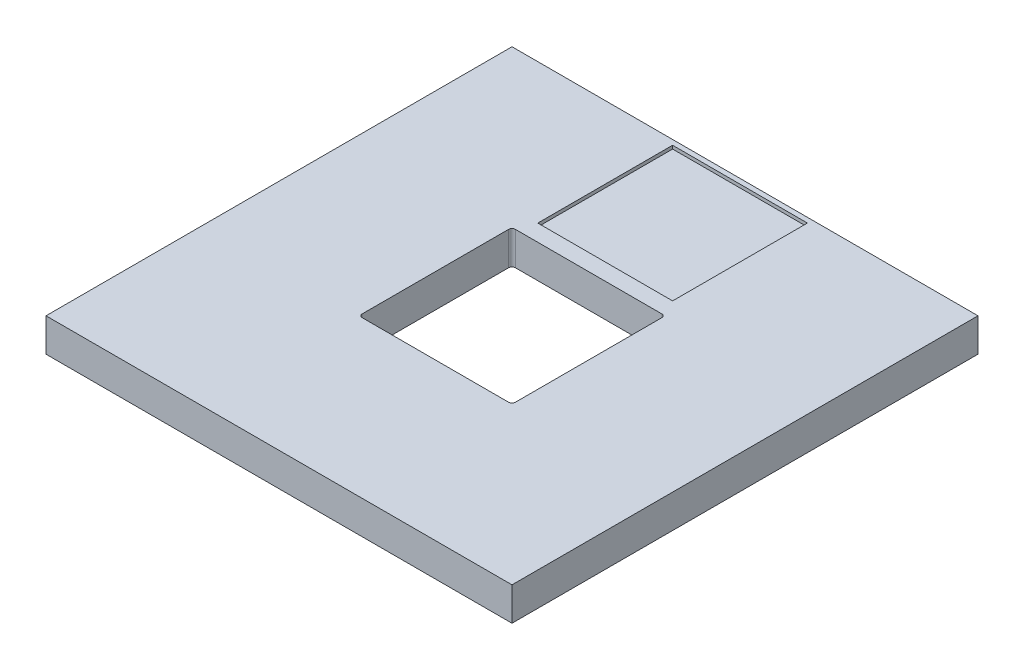
ISO-10303-21;
HEADER;
FILE_DESCRIPTION(('STEP AP214'),'2;1');
FILE_NAME('part.step','',(''),(''),'','','');
FILE_SCHEMA(('AUTOMOTIVE_DESIGN { 1 0 10303 214 1 1 1 1 }'));
ENDSEC;
DATA;
#1=APPLICATION_CONTEXT('core data for automotive mechanical design processes');
#2=APPLICATION_PROTOCOL_DEFINITION('international standard','automotive_design',2000,#1);
#3=PRODUCT_CONTEXT('',#1,'mechanical');
#4=PRODUCT('Part','Part','',(#3));
#5=PRODUCT_RELATED_PRODUCT_CATEGORY('part','',(#4));
#6=PRODUCT_DEFINITION_FORMATION('','',#4);
#7=PRODUCT_DEFINITION_CONTEXT('part definition',#1,'design');
#8=PRODUCT_DEFINITION('design','',#6,#7);
#9=PRODUCT_DEFINITION_SHAPE('','',#8);
#10=(LENGTH_UNIT() NAMED_UNIT(*) SI_UNIT(.MILLI.,.METRE.));
#11=(NAMED_UNIT(*) PLANE_ANGLE_UNIT() SI_UNIT($,.RADIAN.));
#12=(NAMED_UNIT(*) SI_UNIT($,.STERADIAN.) SOLID_ANGLE_UNIT());
#13=UNCERTAINTY_MEASURE_WITH_UNIT(LENGTH_MEASURE(1.E-05),#10,'distance_accuracy_value','');
#14=(GEOMETRIC_REPRESENTATION_CONTEXT(3) GLOBAL_UNCERTAINTY_ASSIGNED_CONTEXT((#13)) GLOBAL_UNIT_ASSIGNED_CONTEXT((#10,
#11,#12)) REPRESENTATION_CONTEXT('',''));
#15=CARTESIAN_POINT('',(0.,0.,0.));
#16=DIRECTION('',(0.,0.,1.));
#17=DIRECTION('',(1.,0.,0.));
#18=AXIS2_PLACEMENT_3D('',#15,#16,#17);
#19=CARTESIAN_POINT('',(0.,10.,0.));
#20=DIRECTION('',(0.,-1.,0.));
#21=DIRECTION('',(0.,0.,-1.));
#22=AXIS2_PLACEMENT_3D('',#19,#20,#21);
#23=PLANE('',#22);
#24=DIRECTION('',(0.,0.,1.));
#25=VECTOR('',#24,1.);
#26=CARTESIAN_POINT('',(90.25,10.,-138.5));
#27=LINE('',#26,#25);
#28=CARTESIAN_POINT('',(90.25,10.,-138.5));
#29=VERTEX_POINT('',#28);
#30=CARTESIAN_POINT('',(90.25,10.,-98.));
#31=VERTEX_POINT('',#30);
#32=EDGE_CURVE('E193',#29,#31,#27,.T.);
#33=ORIENTED_EDGE('',*,*,#32,.T.);
#34=DIRECTION('',(1.,0.,0.));
#35=VECTOR('',#34,1.);
#36=CARTESIAN_POINT('',(49.75,10.,-98.));
#37=LINE('',#36,#35);
#38=CARTESIAN_POINT('',(49.75,10.,-98.));
#39=VERTEX_POINT('',#38);
#40=EDGE_CURVE('E173',#39,#31,#37,.T.);
#41=ORIENTED_EDGE('',*,*,#40,.F.);
#42=DIRECTION('',(0.,0.,1.));
#43=VECTOR('',#42,1.);
#44=CARTESIAN_POINT('',(49.75,10.,-138.5));
#45=LINE('',#44,#43);
#46=CARTESIAN_POINT('',(49.75,10.,-138.5));
#47=VERTEX_POINT('',#46);
#48=EDGE_CURVE('E180',#47,#39,#45,.T.);
#49=ORIENTED_EDGE('',*,*,#48,.F.);
#50=DIRECTION('',(1.,0.,0.));
#51=VECTOR('',#50,1.);
#52=CARTESIAN_POINT('',(49.75,10.,-138.5));
#53=LINE('',#52,#51);
#54=EDGE_CURVE('E184',#47,#29,#53,.T.);
#55=ORIENTED_EDGE('',*,*,#54,.T.);
#56=EDGE_LOOP('',(#33,#41,#49,#55));
#57=FACE_BOUND('',#56,.T.);
#58=DIRECTION('',(0.,0.,1.));
#59=VECTOR('',#58,1.);
#60=CARTESIAN_POINT('',(0.,10.,0.));
#61=LINE('',#60,#59);
#62=CARTESIAN_POINT('',(0.,10.,-140.));
#63=VERTEX_POINT('',#62);
#64=CARTESIAN_POINT('',(0.,10.,0.));
#65=VERTEX_POINT('',#64);
#66=EDGE_CURVE('E239',#63,#65,#61,.T.);
#67=ORIENTED_EDGE('',*,*,#66,.T.);
#68=DIRECTION('',(1.,0.,0.));
#69=VECTOR('',#68,1.);
#70=CARTESIAN_POINT('',(0.,10.,0.));
#71=LINE('',#70,#69);
#72=CARTESIAN_POINT('',(140.,10.,0.));
#73=VERTEX_POINT('',#72);
#74=EDGE_CURVE('E243',#65,#73,#71,.T.);
#75=ORIENTED_EDGE('',*,*,#74,.T.);
#76=DIRECTION('',(0.,0.,-1.));
#77=VECTOR('',#76,1.);
#78=CARTESIAN_POINT('',(140.,10.,0.));
#79=LINE('',#78,#77);
#80=CARTESIAN_POINT('',(140.,10.,-140.));
#81=VERTEX_POINT('',#80);
#82=EDGE_CURVE('E247',#73,#81,#79,.T.);
#83=ORIENTED_EDGE('',*,*,#82,.T.);
#84=DIRECTION('',(-1.,0.,0.));
#85=VECTOR('',#84,1.);
#86=CARTESIAN_POINT('',(0.,10.,-140.));
#87=LINE('',#86,#85);
#88=EDGE_CURVE('E250',#81,#63,#87,.T.);
#89=ORIENTED_EDGE('',*,*,#88,.T.);
#90=EDGE_LOOP('',(#67,#75,#83,#89));
#91=FACE_BOUND('',#90,.T.);
#92=DIRECTION('',(0.,0.,1.));
#93=VECTOR('',#92,1.);
#94=CARTESIAN_POINT('',(47.,10.,-93.));
#95=LINE('',#94,#93);
#96=CARTESIAN_POINT('',(47.,10.,-92.));
#97=VERTEX_POINT('',#96);
#98=CARTESIAN_POINT('',(47.,10.,-48.));
#99=VERTEX_POINT('',#98);
#100=EDGE_CURVE('E208',#97,#99,#95,.T.);
#101=ORIENTED_EDGE('',*,*,#100,.F.);
#102=CARTESIAN_POINT('',(48.,10.,-92.));
#103=DIRECTION('',(0.,-1.,0.));
#104=DIRECTION('',(0.,0.,-1.));
#105=AXIS2_PLACEMENT_3D('',#102,#103,#104);
#106=CIRCLE('',#105,1.);
#107=CARTESIAN_POINT('',(48.,10.,-93.));
#108=VERTEX_POINT('',#107);
#109=EDGE_CURVE('E11',#97,#108,#106,.T.);
#110=ORIENTED_EDGE('',*,*,#109,.T.);
#111=DIRECTION('',(-1.,0.,0.));
#112=VECTOR('',#111,1.);
#113=CARTESIAN_POINT('',(47.,10.,-93.));
#114=LINE('',#113,#112);
#115=CARTESIAN_POINT('',(92.,10.,-93.));
#116=VERTEX_POINT('',#115);
#117=EDGE_CURVE('E221',#116,#108,#114,.T.);
#118=ORIENTED_EDGE('',*,*,#117,.F.);
#119=CARTESIAN_POINT('',(92.,10.,-92.));
#120=DIRECTION('',(0.,-1.,0.));
#121=DIRECTION('',(0.,0.,-1.));
#122=AXIS2_PLACEMENT_3D('',#119,#120,#121);
#123=CIRCLE('',#122,1.);
#124=CARTESIAN_POINT('',(93.,10.,-92.));
#125=VERTEX_POINT('',#124);
#126=EDGE_CURVE('E322',#116,#125,#123,.T.);
#127=ORIENTED_EDGE('',*,*,#126,.T.);
#128=DIRECTION('',(0.,0.,-1.));
#129=VECTOR('',#128,1.);
#130=CARTESIAN_POINT('',(93.,10.,-93.));
#131=LINE('',#130,#129);
#132=CARTESIAN_POINT('',(93.,10.,-48.));
#133=VERTEX_POINT('',#132);
#134=EDGE_CURVE('E217',#133,#125,#131,.T.);
#135=ORIENTED_EDGE('',*,*,#134,.F.);
#136=CARTESIAN_POINT('',(92.,10.,-48.));
#137=DIRECTION('',(0.,-1.,0.));
#138=DIRECTION('',(0.,0.,-1.));
#139=AXIS2_PLACEMENT_3D('',#136,#137,#138);
#140=CIRCLE('',#139,1.);
#141=CARTESIAN_POINT('',(92.,10.,-47.));
#142=VERTEX_POINT('',#141);
#143=EDGE_CURVE('E310',#133,#142,#140,.T.);
#144=ORIENTED_EDGE('',*,*,#143,.T.);
#145=DIRECTION('',(1.,0.,0.));
#146=VECTOR('',#145,1.);
#147=CARTESIAN_POINT('',(47.,10.,-47.));
#148=LINE('',#147,#146);
#149=CARTESIAN_POINT('',(48.,10.,-47.));
#150=VERTEX_POINT('',#149);
#151=EDGE_CURVE('E212',#150,#142,#148,.T.);
#152=ORIENTED_EDGE('',*,*,#151,.F.);
#153=CARTESIAN_POINT('',(48.,10.,-48.));
#154=DIRECTION('',(0.,-1.,0.));
#155=DIRECTION('',(0.,0.,-1.));
#156=AXIS2_PLACEMENT_3D('',#153,#154,#155);
#157=CIRCLE('',#156,1.);
#158=EDGE_CURVE('E316',#150,#99,#157,.T.);
#159=ORIENTED_EDGE('',*,*,#158,.T.);
#160=EDGE_LOOP('',(#101,#110,#118,#127,#135,#144,#152,#159));
#161=FACE_BOUND('',#160,.T.);
#162=ADVANCED_FACE('F39',(#57,#91,#161),#23,.F.);
#163=CARTESIAN_POINT('',(0.,0.,0.));
#164=DIRECTION('',(0.,-1.,0.));
#165=DIRECTION('',(0.,0.,-1.));
#166=AXIS2_PLACEMENT_3D('',#163,#164,#165);
#167=PLANE('',#166);
#168=DIRECTION('',(0.,0.,1.));
#169=VECTOR('',#168,1.);
#170=CARTESIAN_POINT('',(0.,0.,0.));
#171=LINE('',#170,#169);
#172=CARTESIAN_POINT('',(0.,0.,-140.));
#173=VERTEX_POINT('',#172);
#174=CARTESIAN_POINT('',(0.,0.,0.));
#175=VERTEX_POINT('',#174);
#176=EDGE_CURVE('E224',#173,#175,#171,.T.);
#177=ORIENTED_EDGE('',*,*,#176,.F.);
#178=DIRECTION('',(-1.,0.,0.));
#179=VECTOR('',#178,1.);
#180=CARTESIAN_POINT('',(0.,0.,-140.));
#181=LINE('',#180,#179);
#182=CARTESIAN_POINT('',(140.,0.,-140.));
#183=VERTEX_POINT('',#182);
#184=EDGE_CURVE('E244',#183,#173,#181,.T.);
#185=ORIENTED_EDGE('',*,*,#184,.F.);
#186=DIRECTION('',(0.,0.,-1.));
#187=VECTOR('',#186,1.);
#188=CARTESIAN_POINT('',(140.,0.,0.));
#189=LINE('',#188,#187);
#190=CARTESIAN_POINT('',(140.,0.,0.));
#191=VERTEX_POINT('',#190);
#192=EDGE_CURVE('E260',#191,#183,#189,.T.);
#193=ORIENTED_EDGE('',*,*,#192,.F.);
#194=DIRECTION('',(1.,0.,0.));
#195=VECTOR('',#194,1.);
#196=CARTESIAN_POINT('',(0.,0.,0.));
#197=LINE('',#196,#195);
#198=EDGE_CURVE('E257',#175,#191,#197,.T.);
#199=ORIENTED_EDGE('',*,*,#198,.F.);
#200=EDGE_LOOP('',(#177,#185,#193,#199));
#201=FACE_BOUND('',#200,.T.);
#202=DIRECTION('',(0.,0.,-1.));
#203=VECTOR('',#202,1.);
#204=CARTESIAN_POINT('',(93.,0.,-93.));
#205=LINE('',#204,#203);
#206=CARTESIAN_POINT('',(93.,0.,-48.));
#207=VERTEX_POINT('',#206);
#208=CARTESIAN_POINT('',(93.,0.,-92.));
#209=VERTEX_POINT('',#208);
#210=EDGE_CURVE('E232',#207,#209,#205,.T.);
#211=ORIENTED_EDGE('',*,*,#210,.T.);
#212=CARTESIAN_POINT('',(92.,0.,-92.));
#213=DIRECTION('',(0.,-1.,0.));
#214=DIRECTION('',(0.,0.,-1.));
#215=AXIS2_PLACEMENT_3D('',#212,#213,#214);
#216=CIRCLE('',#215,1.);
#217=CARTESIAN_POINT('',(92.,0.,-93.));
#218=VERTEX_POINT('',#217);
#219=EDGE_CURVE('E319',#209,#218,#216,.F.);
#220=ORIENTED_EDGE('',*,*,#219,.T.);
#221=DIRECTION('',(-1.,0.,0.));
#222=VECTOR('',#221,1.);
#223=CARTESIAN_POINT('',(47.,0.,-93.));
#224=LINE('',#223,#222);
#225=CARTESIAN_POINT('',(48.,0.,-93.));
#226=VERTEX_POINT('',#225);
#227=EDGE_CURVE('E213',#218,#226,#224,.T.);
#228=ORIENTED_EDGE('',*,*,#227,.T.);
#229=CARTESIAN_POINT('',(48.,0.,-92.));
#230=DIRECTION('',(0.,-1.,0.));
#231=DIRECTION('',(0.,0.,-1.));
#232=AXIS2_PLACEMENT_3D('',#229,#230,#231);
#233=CIRCLE('',#232,1.);
#234=CARTESIAN_POINT('',(47.,0.,-92.));
#235=VERTEX_POINT('',#234);
#236=EDGE_CURVE('E48',#226,#235,#233,.F.);
#237=ORIENTED_EDGE('',*,*,#236,.T.);
#238=DIRECTION('',(0.,0.,1.));
#239=VECTOR('',#238,1.);
#240=CARTESIAN_POINT('',(47.,0.,-93.));
#241=LINE('',#240,#239);
#242=CARTESIAN_POINT('',(47.,0.,-48.));
#243=VERTEX_POINT('',#242);
#244=EDGE_CURVE('E202',#235,#243,#241,.T.);
#245=ORIENTED_EDGE('',*,*,#244,.T.);
#246=CARTESIAN_POINT('',(48.,0.,-48.));
#247=DIRECTION('',(0.,-1.,0.));
#248=DIRECTION('',(0.,0.,-1.));
#249=AXIS2_PLACEMENT_3D('',#246,#247,#248);
#250=CIRCLE('',#249,1.);
#251=CARTESIAN_POINT('',(48.,0.,-47.));
#252=VERTEX_POINT('',#251);
#253=EDGE_CURVE('E313',#243,#252,#250,.F.);
#254=ORIENTED_EDGE('',*,*,#253,.T.);
#255=DIRECTION('',(1.,0.,0.));
#256=VECTOR('',#255,1.);
#257=CARTESIAN_POINT('',(47.,0.,-47.));
#258=LINE('',#257,#256);
#259=CARTESIAN_POINT('',(92.,0.,-47.));
#260=VERTEX_POINT('',#259);
#261=EDGE_CURVE('E228',#252,#260,#258,.T.);
#262=ORIENTED_EDGE('',*,*,#261,.T.);
#263=CARTESIAN_POINT('',(92.,0.,-48.));
#264=DIRECTION('',(0.,-1.,0.));
#265=DIRECTION('',(0.,0.,-1.));
#266=AXIS2_PLACEMENT_3D('',#263,#264,#265);
#267=CIRCLE('',#266,1.);
#268=EDGE_CURVE('E307',#260,#207,#267,.F.);
#269=ORIENTED_EDGE('',*,*,#268,.T.);
#270=EDGE_LOOP('',(#211,#220,#228,#237,#245,#254,#262,#269));
#271=FACE_BOUND('',#270,.T.);
#272=ADVANCED_FACE('F327',(#201,#271),#167,.T.);
#273=CARTESIAN_POINT('',(0.,10.,0.));
#274=DIRECTION('',(1.,0.,0.));
#275=DIRECTION('',(0.,0.,-1.));
#276=AXIS2_PLACEMENT_3D('',#273,#274,#275);
#277=PLANE('',#276);
#278=ORIENTED_EDGE('',*,*,#176,.T.);
#279=DIRECTION('',(0.,-1.,0.));
#280=VECTOR('',#279,1.);
#281=CARTESIAN_POINT('',(0.,10.,0.));
#282=LINE('',#281,#280);
#283=EDGE_CURVE('E276',#65,#175,#282,.T.);
#284=ORIENTED_EDGE('',*,*,#283,.F.);
#285=ORIENTED_EDGE('',*,*,#66,.F.);
#286=DIRECTION('',(0.,-1.,0.));
#287=VECTOR('',#286,1.);
#288=CARTESIAN_POINT('',(0.,10.,-140.));
#289=LINE('',#288,#287);
#290=EDGE_CURVE('E253',#63,#173,#289,.T.);
#291=ORIENTED_EDGE('',*,*,#290,.T.);
#292=EDGE_LOOP('',(#278,#284,#285,#291));
#293=FACE_BOUND('',#292,.T.);
#294=ADVANCED_FACE('F369',(#293),#277,.F.);
#295=CARTESIAN_POINT('',(0.,10.,0.));
#296=DIRECTION('',(0.,0.,-1.));
#297=DIRECTION('',(-1.,0.,0.));
#298=AXIS2_PLACEMENT_3D('',#295,#296,#297);
#299=PLANE('',#298);
#300=ORIENTED_EDGE('',*,*,#198,.T.);
#301=DIRECTION('',(0.,-1.,0.));
#302=VECTOR('',#301,1.);
#303=CARTESIAN_POINT('',(140.,10.,0.));
#304=LINE('',#303,#302);
#305=EDGE_CURVE('E272',#73,#191,#304,.T.);
#306=ORIENTED_EDGE('',*,*,#305,.F.);
#307=ORIENTED_EDGE('',*,*,#74,.F.);
#308=ORIENTED_EDGE('',*,*,#283,.T.);
#309=EDGE_LOOP('',(#300,#306,#307,#308));
#310=FACE_BOUND('',#309,.T.);
#311=ADVANCED_FACE('F383',(#310),#299,.F.);
#312=CARTESIAN_POINT('',(140.,10.,0.));
#313=DIRECTION('',(-1.,0.,0.));
#314=DIRECTION('',(0.,0.,1.));
#315=AXIS2_PLACEMENT_3D('',#312,#313,#314);
#316=PLANE('',#315);
#317=ORIENTED_EDGE('',*,*,#192,.T.);
#318=DIRECTION('',(0.,-1.,0.));
#319=VECTOR('',#318,1.);
#320=CARTESIAN_POINT('',(140.,10.,-140.));
#321=LINE('',#320,#319);
#322=EDGE_CURVE('E268',#81,#183,#321,.T.);
#323=ORIENTED_EDGE('',*,*,#322,.F.);
#324=ORIENTED_EDGE('',*,*,#82,.F.);
#325=ORIENTED_EDGE('',*,*,#305,.T.);
#326=EDGE_LOOP('',(#317,#323,#324,#325));
#327=FACE_BOUND('',#326,.T.);
#328=ADVANCED_FACE('F379',(#327),#316,.F.);
#329=CARTESIAN_POINT('',(0.,10.,-140.));
#330=DIRECTION('',(0.,0.,1.));
#331=DIRECTION('',(1.,0.,0.));
#332=AXIS2_PLACEMENT_3D('',#329,#330,#331);
#333=PLANE('',#332);
#334=ORIENTED_EDGE('',*,*,#184,.T.);
#335=ORIENTED_EDGE('',*,*,#290,.F.);
#336=ORIENTED_EDGE('',*,*,#88,.F.);
#337=ORIENTED_EDGE('',*,*,#322,.T.);
#338=EDGE_LOOP('',(#334,#335,#336,#337));
#339=FACE_BOUND('',#338,.T.);
#340=ADVANCED_FACE('F376',(#339),#333,.F.);
#341=CARTESIAN_POINT('',(47.,10.,-93.));
#342=DIRECTION('',(1.,0.,0.));
#343=DIRECTION('',(0.,0.,-1.));
#344=AXIS2_PLACEMENT_3D('',#341,#342,#343);
#345=PLANE('',#344);
#346=ORIENTED_EDGE('',*,*,#100,.T.);
#347=DIRECTION('',(0.,-1.,0.));
#348=VECTOR('',#347,1.);
#349=CARTESIAN_POINT('',(47.,0.,-48.));
#350=LINE('',#349,#348);
#351=EDGE_CURVE('E297',#99,#243,#350,.T.);
#352=ORIENTED_EDGE('',*,*,#351,.T.);
#353=ORIENTED_EDGE('',*,*,#244,.F.);
#354=DIRECTION('',(0.,-1.,0.));
#355=VECTOR('',#354,1.);
#356=CARTESIAN_POINT('',(47.,10.,-92.));
#357=LINE('',#356,#355);
#358=EDGE_CURVE('E294',#235,#97,#357,.F.);
#359=ORIENTED_EDGE('',*,*,#358,.T.);
#360=EDGE_LOOP('',(#346,#352,#353,#359));
#361=FACE_BOUND('',#360,.T.);
#362=ADVANCED_FACE('F332',(#361),#345,.T.);
#363=CARTESIAN_POINT('',(47.,10.,-47.));
#364=DIRECTION('',(0.,0.,-1.));
#365=DIRECTION('',(-1.,0.,0.));
#366=AXIS2_PLACEMENT_3D('',#363,#364,#365);
#367=PLANE('',#366);
#368=ORIENTED_EDGE('',*,*,#151,.T.);
#369=DIRECTION('',(0.,-1.,0.));
#370=VECTOR('',#369,1.);
#371=CARTESIAN_POINT('',(92.,0.,-47.));
#372=LINE('',#371,#370);
#373=EDGE_CURVE('E283',#142,#260,#372,.T.);
#374=ORIENTED_EDGE('',*,*,#373,.T.);
#375=ORIENTED_EDGE('',*,*,#261,.F.);
#376=DIRECTION('',(0.,-1.,0.));
#377=VECTOR('',#376,1.);
#378=CARTESIAN_POINT('',(48.,10.,-47.));
#379=LINE('',#378,#377);
#380=EDGE_CURVE('E280',#252,#150,#379,.F.);
#381=ORIENTED_EDGE('',*,*,#380,.T.);
#382=EDGE_LOOP('',(#368,#374,#375,#381));
#383=FACE_BOUND('',#382,.T.);
#384=ADVANCED_FACE('F350',(#383),#367,.T.);
#385=CARTESIAN_POINT('',(93.,10.,-93.));
#386=DIRECTION('',(-1.,0.,0.));
#387=DIRECTION('',(0.,0.,1.));
#388=AXIS2_PLACEMENT_3D('',#385,#386,#387);
#389=PLANE('',#388);
#390=ORIENTED_EDGE('',*,*,#210,.F.);
#391=DIRECTION('',(0.,-1.,0.));
#392=VECTOR('',#391,1.);
#393=CARTESIAN_POINT('',(93.,10.,-48.));
#394=LINE('',#393,#392);
#395=EDGE_CURVE('E291',#207,#133,#394,.F.);
#396=ORIENTED_EDGE('',*,*,#395,.T.);
#397=ORIENTED_EDGE('',*,*,#134,.T.);
#398=DIRECTION('',(0.,-1.,0.));
#399=VECTOR('',#398,1.);
#400=CARTESIAN_POINT('',(93.,0.,-92.));
#401=LINE('',#400,#399);
#402=EDGE_CURVE('E287',#125,#209,#401,.T.);
#403=ORIENTED_EDGE('',*,*,#402,.T.);
#404=EDGE_LOOP('',(#390,#396,#397,#403));
#405=FACE_BOUND('',#404,.T.);
#406=ADVANCED_FACE('F342',(#405),#389,.T.);
#407=CARTESIAN_POINT('',(47.,10.,-93.));
#408=DIRECTION('',(0.,0.,1.));
#409=DIRECTION('',(1.,0.,0.));
#410=AXIS2_PLACEMENT_3D('',#407,#408,#409);
#411=PLANE('',#410);
#412=ORIENTED_EDGE('',*,*,#227,.F.);
#413=DIRECTION('',(0.,-1.,0.));
#414=VECTOR('',#413,1.);
#415=CARTESIAN_POINT('',(92.,10.,-93.));
#416=LINE('',#415,#414);
#417=EDGE_CURVE('E60',#218,#116,#416,.F.);
#418=ORIENTED_EDGE('',*,*,#417,.T.);
#419=ORIENTED_EDGE('',*,*,#117,.T.);
#420=DIRECTION('',(0.,-1.,0.));
#421=VECTOR('',#420,1.);
#422=CARTESIAN_POINT('',(48.,0.,-93.));
#423=LINE('',#422,#421);
#424=EDGE_CURVE('E301',#108,#226,#423,.T.);
#425=ORIENTED_EDGE('',*,*,#424,.T.);
#426=EDGE_LOOP('',(#412,#418,#419,#425));
#427=FACE_BOUND('',#426,.T.);
#428=ADVANCED_FACE('F334',(#427),#411,.T.);
#429=CARTESIAN_POINT('',(49.75,9.,-98.));
#430=DIRECTION('',(0.,0.,1.));
#431=DIRECTION('',(1.,0.,0.));
#432=AXIS2_PLACEMENT_3D('',#429,#430,#431);
#433=PLANE('',#432);
#434=ORIENTED_EDGE('',*,*,#40,.T.);
#435=DIRECTION('',(0.,1.,0.));
#436=VECTOR('',#435,1.);
#437=CARTESIAN_POINT('',(90.25,9.,-98.));
#438=LINE('',#437,#436);
#439=CARTESIAN_POINT('',(90.25,9.,-98.));
#440=VERTEX_POINT('',#439);
#441=EDGE_CURVE('E158',#440,#31,#438,.T.);
#442=ORIENTED_EDGE('',*,*,#441,.F.);
#443=DIRECTION('',(1.,0.,0.));
#444=VECTOR('',#443,1.);
#445=CARTESIAN_POINT('',(49.75,9.,-98.));
#446=LINE('',#445,#444);
#447=CARTESIAN_POINT('',(49.75,9.,-98.));
#448=VERTEX_POINT('',#447);
#449=EDGE_CURVE('E166',#448,#440,#446,.T.);
#450=ORIENTED_EDGE('',*,*,#449,.F.);
#451=DIRECTION('',(0.,1.,0.));
#452=VECTOR('',#451,1.);
#453=CARTESIAN_POINT('',(49.75,9.,-98.));
#454=LINE('',#453,#452);
#455=EDGE_CURVE('E199',#448,#39,#454,.T.);
#456=ORIENTED_EDGE('',*,*,#455,.T.);
#457=EDGE_LOOP('',(#434,#442,#450,#456));
#458=FACE_BOUND('',#457,.T.);
#459=ADVANCED_FACE('F170',(#458),#433,.F.);
#460=CARTESIAN_POINT('',(49.75,9.,-138.5));
#461=DIRECTION('',(-1.,0.,0.));
#462=DIRECTION('',(0.,0.,1.));
#463=AXIS2_PLACEMENT_3D('',#460,#461,#462);
#464=PLANE('',#463);
#465=ORIENTED_EDGE('',*,*,#48,.T.);
#466=ORIENTED_EDGE('',*,*,#455,.F.);
#467=DIRECTION('',(0.,0.,1.));
#468=VECTOR('',#467,1.);
#469=CARTESIAN_POINT('',(49.75,9.,-138.5));
#470=LINE('',#469,#468);
#471=CARTESIAN_POINT('',(49.75,9.,-138.5));
#472=VERTEX_POINT('',#471);
#473=EDGE_CURVE('E175',#472,#448,#470,.T.);
#474=ORIENTED_EDGE('',*,*,#473,.F.);
#475=DIRECTION('',(0.,1.,0.));
#476=VECTOR('',#475,1.);
#477=CARTESIAN_POINT('',(49.75,9.,-138.5));
#478=LINE('',#477,#476);
#479=EDGE_CURVE('E203',#472,#47,#478,.T.);
#480=ORIENTED_EDGE('',*,*,#479,.T.);
#481=EDGE_LOOP('',(#465,#466,#474,#480));
#482=FACE_BOUND('',#481,.T.);
#483=ADVANCED_FACE('F445',(#482),#464,.F.);
#484=CARTESIAN_POINT('',(49.75,9.,-138.5));
#485=DIRECTION('',(0.,0.,1.));
#486=DIRECTION('',(1.,0.,0.));
#487=AXIS2_PLACEMENT_3D('',#484,#485,#486);
#488=PLANE('',#487);
#489=ORIENTED_EDGE('',*,*,#54,.F.);
#490=ORIENTED_EDGE('',*,*,#479,.F.);
#491=DIRECTION('',(1.,0.,0.));
#492=VECTOR('',#491,1.);
#493=CARTESIAN_POINT('',(49.75,9.,-138.5));
#494=LINE('',#493,#492);
#495=CARTESIAN_POINT('',(90.25,9.,-138.5));
#496=VERTEX_POINT('',#495);
#497=EDGE_CURVE('E165',#472,#496,#494,.T.);
#498=ORIENTED_EDGE('',*,*,#497,.T.);
#499=DIRECTION('',(0.,1.,0.));
#500=VECTOR('',#499,1.);
#501=CARTESIAN_POINT('',(90.25,9.,-138.5));
#502=LINE('',#501,#500);
#503=EDGE_CURVE('E160',#496,#29,#502,.T.);
#504=ORIENTED_EDGE('',*,*,#503,.T.);
#505=EDGE_LOOP('',(#489,#490,#498,#504));
#506=FACE_BOUND('',#505,.T.);
#507=ADVANCED_FACE('F452',(#506),#488,.T.);
#508=CARTESIAN_POINT('',(90.25,9.,-138.5));
#509=DIRECTION('',(-1.,0.,0.));
#510=DIRECTION('',(0.,0.,1.));
#511=AXIS2_PLACEMENT_3D('',#508,#509,#510);
#512=PLANE('',#511);
#513=ORIENTED_EDGE('',*,*,#32,.F.);
#514=ORIENTED_EDGE('',*,*,#503,.F.);
#515=DIRECTION('',(0.,0.,1.));
#516=VECTOR('',#515,1.);
#517=CARTESIAN_POINT('',(90.25,9.,-138.5));
#518=LINE('',#517,#516);
#519=EDGE_CURVE('E154',#496,#440,#518,.T.);
#520=ORIENTED_EDGE('',*,*,#519,.T.);
#521=ORIENTED_EDGE('',*,*,#441,.T.);
#522=EDGE_LOOP('',(#513,#514,#520,#521));
#523=FACE_BOUND('',#522,.T.);
#524=ADVANCED_FACE('F157',(#523),#512,.T.);
#525=CARTESIAN_POINT('',(0.,9.,0.));
#526=DIRECTION('',(0.,-1.,0.));
#527=DIRECTION('',(0.,0.,-1.));
#528=AXIS2_PLACEMENT_3D('',#525,#526,#527);
#529=PLANE('',#528);
#530=ORIENTED_EDGE('',*,*,#449,.T.);
#531=ORIENTED_EDGE('',*,*,#519,.F.);
#532=ORIENTED_EDGE('',*,*,#497,.F.);
#533=ORIENTED_EDGE('',*,*,#473,.T.);
#534=EDGE_LOOP('',(#530,#531,#532,#533));
#535=FACE_BOUND('',#534,.T.);
#536=ADVANCED_FACE('F177',(#535),#529,.F.);
#537=CARTESIAN_POINT('',(92.,10.,-48.));
#538=DIRECTION('',(0.,1.,0.));
#539=DIRECTION('',(0.,0.,1.));
#540=AXIS2_PLACEMENT_3D('',#537,#538,#539);
#541=CYLINDRICAL_SURFACE('',#540,1.);
#542=ORIENTED_EDGE('',*,*,#143,.F.);
#543=ORIENTED_EDGE('',*,*,#395,.F.);
#544=ORIENTED_EDGE('',*,*,#268,.F.);
#545=ORIENTED_EDGE('',*,*,#373,.F.);
#546=EDGE_LOOP('',(#542,#543,#544,#545));
#547=FACE_BOUND('',#546,.T.);
#548=ADVANCED_FACE('F348',(#547),#541,.F.);
#549=CARTESIAN_POINT('',(48.,10.,-48.));
#550=DIRECTION('',(0.,1.,0.));
#551=DIRECTION('',(0.,0.,1.));
#552=AXIS2_PLACEMENT_3D('',#549,#550,#551);
#553=CYLINDRICAL_SURFACE('',#552,1.);
#554=ORIENTED_EDGE('',*,*,#158,.F.);
#555=ORIENTED_EDGE('',*,*,#380,.F.);
#556=ORIENTED_EDGE('',*,*,#253,.F.);
#557=ORIENTED_EDGE('',*,*,#351,.F.);
#558=EDGE_LOOP('',(#554,#555,#556,#557));
#559=FACE_BOUND('',#558,.T.);
#560=ADVANCED_FACE('F355',(#559),#553,.F.);
#561=CARTESIAN_POINT('',(92.,10.,-92.));
#562=DIRECTION('',(0.,1.,0.));
#563=DIRECTION('',(0.,0.,1.));
#564=AXIS2_PLACEMENT_3D('',#561,#562,#563);
#565=CYLINDRICAL_SURFACE('',#564,1.);
#566=ORIENTED_EDGE('',*,*,#126,.F.);
#567=ORIENTED_EDGE('',*,*,#417,.F.);
#568=ORIENTED_EDGE('',*,*,#219,.F.);
#569=ORIENTED_EDGE('',*,*,#402,.F.);
#570=EDGE_LOOP('',(#566,#567,#568,#569));
#571=FACE_BOUND('',#570,.T.);
#572=ADVANCED_FACE('F339',(#571),#565,.F.);
#573=CARTESIAN_POINT('',(48.,10.,-92.));
#574=DIRECTION('',(0.,1.,0.));
#575=DIRECTION('',(0.,0.,1.));
#576=AXIS2_PLACEMENT_3D('',#573,#574,#575);
#577=CYLINDRICAL_SURFACE('',#576,1.);
#578=ORIENTED_EDGE('',*,*,#109,.F.);
#579=ORIENTED_EDGE('',*,*,#358,.F.);
#580=ORIENTED_EDGE('',*,*,#236,.F.);
#581=ORIENTED_EDGE('',*,*,#424,.F.);
#582=EDGE_LOOP('',(#578,#579,#580,#581));
#583=FACE_BOUND('',#582,.T.);
#584=ADVANCED_FACE('F41',(#583),#577,.F.);
#585=CLOSED_SHELL('',(#162,#272,#294,#311,#328,#340,#362,#384,#406,#428,#459,#483,#507,#524,
#536,#548,#560,#572,#584));
#586=MANIFOLD_SOLID_BREP('B2',#585);
#587=ADVANCED_BREP_SHAPE_REPRESENTATION('',(#18,#586),#14);
#588=SHAPE_DEFINITION_REPRESENTATION(#9,#587);
ENDSEC;
END-ISO-10303-21;
